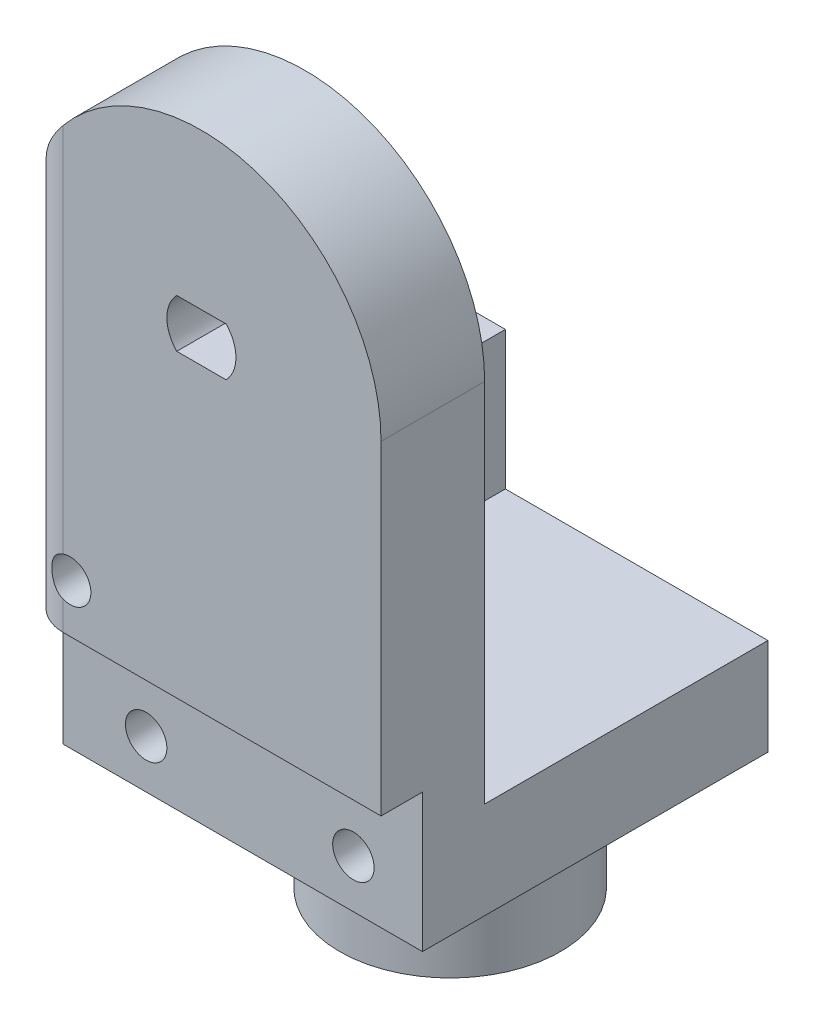
ISO-10303-21;
HEADER;
FILE_DESCRIPTION(('STEP AP214'),'2;1');
FILE_NAME('part.step','',(''),(''),'','','');
FILE_SCHEMA(('AUTOMOTIVE_DESIGN { 1 0 10303 214 1 1 1 1 }'));
ENDSEC;
DATA;
#1=APPLICATION_CONTEXT('core data for automotive mechanical design processes');
#2=APPLICATION_PROTOCOL_DEFINITION('international standard','automotive_design',2000,#1);
#3=PRODUCT_CONTEXT('',#1,'mechanical');
#4=PRODUCT('Part','Part','',(#3));
#5=PRODUCT_RELATED_PRODUCT_CATEGORY('part','',(#4));
#6=PRODUCT_DEFINITION_FORMATION('','',#4);
#7=PRODUCT_DEFINITION_CONTEXT('part definition',#1,'design');
#8=PRODUCT_DEFINITION('design','',#6,#7);
#9=PRODUCT_DEFINITION_SHAPE('','',#8);
#10=(LENGTH_UNIT() NAMED_UNIT(*) SI_UNIT(.MILLI.,.METRE.));
#11=(NAMED_UNIT(*) PLANE_ANGLE_UNIT() SI_UNIT($,.RADIAN.));
#12=(NAMED_UNIT(*) SI_UNIT($,.STERADIAN.) SOLID_ANGLE_UNIT());
#13=UNCERTAINTY_MEASURE_WITH_UNIT(LENGTH_MEASURE(1.E-05),#10,'distance_accuracy_value','');
#14=(GEOMETRIC_REPRESENTATION_CONTEXT(3) GLOBAL_UNCERTAINTY_ASSIGNED_CONTEXT((#13)) GLOBAL_UNIT_ASSIGNED_CONTEXT((#10,
#11,#12)) REPRESENTATION_CONTEXT('',''));
#15=CARTESIAN_POINT('',(0.,0.,0.));
#16=DIRECTION('',(0.,0.,1.));
#17=DIRECTION('',(1.,0.,0.));
#18=AXIS2_PLACEMENT_3D('',#15,#16,#17);
#19=CARTESIAN_POINT('',(24.2641007815364,-54.,8.));
#20=DIRECTION('',(0.,1.,0.));
#21=DIRECTION('',(0.,0.,1.));
#22=AXIS2_PLACEMENT_3D('',#19,#20,#21);
#23=PLANE('',#22);
#24=DIRECTION('',(-1.,0.,0.));
#25=VECTOR('',#24,1.);
#26=CARTESIAN_POINT('',(24.2641007815364,-54.,-20.));
#27=LINE('',#26,#25);
#28=CARTESIAN_POINT('',(50.2641007815364,-54.,-20.));
#29=VERTEX_POINT('',#28);
#30=CARTESIAN_POINT('',(37.2641007815364,-54.,-20.));
#31=VERTEX_POINT('',#30);
#32=EDGE_CURVE('E150',#29,#31,#27,.T.);
#33=ORIENTED_EDGE('',*,*,#32,.F.);
#34=DIRECTION('',(0.,0.,-1.));
#35=VECTOR('',#34,1.);
#36=CARTESIAN_POINT('',(50.2641007815364,-54.,8.));
#37=LINE('',#36,#35);
#38=CARTESIAN_POINT('',(50.2641007815364,-54.,5.));
#39=VERTEX_POINT('',#38);
#40=EDGE_CURVE('E292',#39,#29,#37,.T.);
#41=ORIENTED_EDGE('',*,*,#40,.F.);
#42=DIRECTION('',(1.,0.,0.));
#43=VECTOR('',#42,1.);
#44=CARTESIAN_POINT('',(50.2641007815364,-54.,5.));
#45=LINE('',#44,#43);
#46=CARTESIAN_POINT('',(24.2641007815364,-54.,5.));
#47=VERTEX_POINT('',#46);
#48=EDGE_CURVE('E603',#47,#39,#45,.T.);
#49=ORIENTED_EDGE('',*,*,#48,.F.);
#50=DIRECTION('',(0.,0.,-1.));
#51=VECTOR('',#50,1.);
#52=CARTESIAN_POINT('',(24.2641007815364,-54.,8.));
#53=LINE('',#52,#51);
#54=CARTESIAN_POINT('',(24.2641007815364,-54.,-20.));
#55=VERTEX_POINT('',#54);
#56=EDGE_CURVE('E167',#47,#55,#53,.T.);
#57=ORIENTED_EDGE('',*,*,#56,.T.);
#58=EDGE_CURVE('E153',#31,#55,#27,.T.);
#59=ORIENTED_EDGE('',*,*,#58,.F.);
#60=CARTESIAN_POINT('',(37.2641007815364,-54.,-10.));
#61=DIRECTION('',(0.,1.,0.));
#62=DIRECTION('',(0.,0.,1.));
#63=AXIS2_PLACEMENT_3D('',#60,#61,#62);
#64=CIRCLE('',#63,9.99999999999998);
#65=EDGE_CURVE('E164',#31,#31,#64,.T.);
#66=ORIENTED_EDGE('',*,*,#65,.T.);
#67=EDGE_LOOP('',(#33,#41,#49,#57,#59,#66));
#68=FACE_BOUND('',#67,.T.);
#69=ADVANCED_FACE('F37',(#68),#23,.F.);
#70=CARTESIAN_POINT('',(50.2641007815364,-54.,8.));
#71=DIRECTION('',(-1.,0.,0.));
#72=DIRECTION('',(0.,0.,1.));
#73=AXIS2_PLACEMENT_3D('',#70,#71,#72);
#74=PLANE('',#73);
#75=DIRECTION('',(0.,-1.,0.));
#76=VECTOR('',#75,1.);
#77=CARTESIAN_POINT('',(50.2641007815364,-54.,-20.));
#78=LINE('',#77,#76);
#79=CARTESIAN_POINT('',(50.2641007815364,-47.,-20.));
#80=VERTEX_POINT('',#79);
#81=EDGE_CURVE('E156',#80,#29,#78,.T.);
#82=ORIENTED_EDGE('',*,*,#81,.F.);
#83=DIRECTION('',(0.,0.,1.));
#84=VECTOR('',#83,1.);
#85=CARTESIAN_POINT('',(50.2641007815364,-47.,-54.9258240356725));
#86=LINE('',#85,#84);
#87=CARTESIAN_POINT('',(50.2641007815364,-47.,0.5));
#88=VERTEX_POINT('',#87);
#89=EDGE_CURVE('E267',#80,#88,#86,.T.);
#90=ORIENTED_EDGE('',*,*,#89,.T.);
#91=DIRECTION('',(0.,-1.,0.));
#92=VECTOR('',#91,1.);
#93=CARTESIAN_POINT('',(50.2641007815364,-4.,0.5));
#94=LINE('',#93,#92);
#95=CARTESIAN_POINT('',(50.2641007815364,-20.5159979477303,0.5));
#96=VERTEX_POINT('',#95);
#97=EDGE_CURVE('E238',#96,#88,#94,.T.);
#98=ORIENTED_EDGE('',*,*,#97,.F.);
#99=DIRECTION('',(0.,0.,1.));
#100=VECTOR('',#99,1.);
#101=CARTESIAN_POINT('',(50.2641007815364,-20.5159979477303,-62.5689387206191));
#102=LINE('',#101,#100);
#103=CARTESIAN_POINT('',(50.2641007815364,-20.5159979477303,8.));
#104=VERTEX_POINT('',#103);
#105=EDGE_CURVE('E599',#96,#104,#102,.T.);
#106=ORIENTED_EDGE('',*,*,#105,.T.);
#107=DIRECTION('',(0.,1.,0.));
#108=VECTOR('',#107,1.);
#109=CARTESIAN_POINT('',(50.2641007815364,-54.,8.));
#110=LINE('',#109,#108);
#111=CARTESIAN_POINT('',(50.2641007815364,-44.,8.));
#112=VERTEX_POINT('',#111);
#113=EDGE_CURVE('E290',#112,#104,#110,.T.);
#114=ORIENTED_EDGE('',*,*,#113,.F.);
#115=DIRECTION('',(0.,0.,1.));
#116=VECTOR('',#115,1.);
#117=CARTESIAN_POINT('',(50.2641007815364,-44.,5.));
#118=LINE('',#117,#116);
#119=CARTESIAN_POINT('',(50.2641007815364,-44.,5.));
#120=VERTEX_POINT('',#119);
#121=EDGE_CURVE('E605',#120,#112,#118,.T.);
#122=ORIENTED_EDGE('',*,*,#121,.F.);
#123=DIRECTION('',(0.,1.,0.));
#124=VECTOR('',#123,1.);
#125=CARTESIAN_POINT('',(50.2641007815364,-54.,5.));
#126=LINE('',#125,#124);
#127=EDGE_CURVE('E187',#39,#120,#126,.T.);
#128=ORIENTED_EDGE('',*,*,#127,.F.);
#129=ORIENTED_EDGE('',*,*,#40,.T.);
#130=EDGE_LOOP('',(#82,#90,#98,#106,#114,#122,#128,#129));
#131=FACE_BOUND('',#130,.T.);
#132=ADVANCED_FACE('F336',(#131),#74,.F.);
#133=CARTESIAN_POINT('',(24.2641007815364,-47.,-54.9258240356725));
#134=DIRECTION('',(0.,1.,0.));
#135=DIRECTION('',(0.,0.,1.));
#136=AXIS2_PLACEMENT_3D('',#133,#134,#135);
#137=PLANE('',#136);
#138=ORIENTED_EDGE('',*,*,#89,.F.);
#139=DIRECTION('',(-1.,0.,0.));
#140=VECTOR('',#139,1.);
#141=CARTESIAN_POINT('',(24.2641007815364,-47.,-20.));
#142=LINE('',#141,#140);
#143=CARTESIAN_POINT('',(31.2641007815364,-47.,-20.));
#144=VERTEX_POINT('',#143);
#145=EDGE_CURVE('E168',#80,#144,#142,.T.);
#146=ORIENTED_EDGE('',*,*,#145,.T.);
#147=DIRECTION('',(0.,0.,1.));
#148=VECTOR('',#147,1.);
#149=CARTESIAN_POINT('',(31.2641007815364,-47.,-54.9258240356725));
#150=LINE('',#149,#148);
#151=CARTESIAN_POINT('',(31.2641007815364,-47.,0.5));
#152=VERTEX_POINT('',#151);
#153=EDGE_CURVE('E256',#144,#152,#150,.T.);
#154=ORIENTED_EDGE('',*,*,#153,.T.);
#155=DIRECTION('',(-1.,0.,0.));
#156=VECTOR('',#155,1.);
#157=CARTESIAN_POINT('',(50.2641007815364,-47.,0.5));
#158=LINE('',#157,#156);
#159=EDGE_CURVE('E224',#88,#152,#158,.T.);
#160=ORIENTED_EDGE('',*,*,#159,.F.);
#161=EDGE_LOOP('',(#138,#146,#154,#160));
#162=FACE_BOUND('',#161,.T.);
#163=ADVANCED_FACE('F343',(#162),#137,.T.);
#164=CARTESIAN_POINT('',(24.2641007815364,-54.,8.));
#165=DIRECTION('',(1.,0.,0.));
#166=DIRECTION('',(0.,1.,0.));
#167=AXIS2_PLACEMENT_3D('',#164,#165,#166);
#168=PLANE('',#167);
#169=DIRECTION('',(0.,1.,0.));
#170=VECTOR('',#169,1.);
#171=CARTESIAN_POINT('',(24.2641007815364,-54.,-20.));
#172=LINE('',#171,#170);
#173=CARTESIAN_POINT('',(24.2641007815364,-37.,-20.));
#174=VERTEX_POINT('',#173);
#175=EDGE_CURVE('E568',#55,#174,#172,.T.);
#176=ORIENTED_EDGE('',*,*,#175,.F.);
#177=ORIENTED_EDGE('',*,*,#56,.F.);
#178=DIRECTION('',(0.,-1.,0.));
#179=VECTOR('',#178,1.);
#180=CARTESIAN_POINT('',(24.2641007815364,-54.,5.));
#181=LINE('',#180,#179);
#182=CARTESIAN_POINT('',(24.2641007815364,-44.,5.));
#183=VERTEX_POINT('',#182);
#184=EDGE_CURVE('E300',#47,#183,#181,.F.);
#185=ORIENTED_EDGE('',*,*,#184,.T.);
#186=CARTESIAN_POINT('',(24.2641007815364,-20.5159979477303,5.));
#187=VERTEX_POINT('',#186);
#188=EDGE_CURVE('E299',#183,#187,#181,.F.);
#189=ORIENTED_EDGE('',*,*,#188,.T.);
#190=DIRECTION('',(0.,0.,1.));
#191=VECTOR('',#190,1.);
#192=CARTESIAN_POINT('',(24.2641007815364,-20.5159979477303,-62.5689387206191));
#193=LINE('',#192,#191);
#194=CARTESIAN_POINT('',(24.2641007815364,-20.5159979477303,0.5));
#195=VERTEX_POINT('',#194);
#196=EDGE_CURVE('E615',#195,#187,#193,.T.);
#197=ORIENTED_EDGE('',*,*,#196,.F.);
#198=DIRECTION('',(0.,1.,0.));
#199=VECTOR('',#198,1.);
#200=CARTESIAN_POINT('',(24.2641007815364,-37.,0.5));
#201=LINE('',#200,#199);
#202=CARTESIAN_POINT('',(24.2641007815364,-37.,0.5));
#203=VERTEX_POINT('',#202);
#204=EDGE_CURVE('E235',#203,#195,#201,.T.);
#205=ORIENTED_EDGE('',*,*,#204,.F.);
#206=DIRECTION('',(0.,0.,-1.));
#207=VECTOR('',#206,1.);
#208=CARTESIAN_POINT('',(24.2641007815364,-37.,18.3847763108502));
#209=LINE('',#208,#207);
#210=EDGE_CURVE('E250',#203,#174,#209,.T.);
#211=ORIENTED_EDGE('',*,*,#210,.T.);
#212=EDGE_LOOP('',(#176,#177,#185,#189,#197,#205,#211));
#213=FACE_BOUND('',#212,.T.);
#214=ADVANCED_FACE('F375',(#213),#168,.F.);
#215=CARTESIAN_POINT('',(24.2641007815364,-37.,18.3847763108502));
#216=DIRECTION('',(0.,-1.,0.));
#217=DIRECTION('',(0.,0.,-1.));
#218=AXIS2_PLACEMENT_3D('',#215,#216,#217);
#219=PLANE('',#218);
#220=DIRECTION('',(1.,0.,0.));
#221=VECTOR('',#220,1.);
#222=CARTESIAN_POINT('',(24.2641007815364,-37.,-20.));
#223=LINE('',#222,#221);
#224=CARTESIAN_POINT('',(31.2641007815364,-37.,-20.));
#225=VERTEX_POINT('',#224);
#226=EDGE_CURVE('E54',#174,#225,#223,.T.);
#227=ORIENTED_EDGE('',*,*,#226,.F.);
#228=ORIENTED_EDGE('',*,*,#210,.F.);
#229=DIRECTION('',(-1.,0.,0.));
#230=VECTOR('',#229,1.);
#231=CARTESIAN_POINT('',(31.2641007815364,-37.,0.5));
#232=LINE('',#231,#230);
#233=CARTESIAN_POINT('',(31.2641007815364,-37.,0.5));
#234=VERTEX_POINT('',#233);
#235=EDGE_CURVE('E232',#234,#203,#232,.T.);
#236=ORIENTED_EDGE('',*,*,#235,.F.);
#237=DIRECTION('',(0.,0.,-1.));
#238=VECTOR('',#237,1.);
#239=CARTESIAN_POINT('',(31.2641007815364,-37.,18.3847763108502));
#240=LINE('',#239,#238);
#241=EDGE_CURVE('E253',#234,#225,#240,.T.);
#242=ORIENTED_EDGE('',*,*,#241,.T.);
#243=EDGE_LOOP('',(#227,#228,#236,#242));
#244=FACE_BOUND('',#243,.T.);
#245=ADVANCED_FACE('F480',(#244),#219,.F.);
#246=CARTESIAN_POINT('',(31.2641007815364,-37.,18.3847763108502));
#247=DIRECTION('',(-1.,0.,0.));
#248=DIRECTION('',(0.,0.,1.));
#249=AXIS2_PLACEMENT_3D('',#246,#247,#248);
#250=PLANE('',#249);
#251=DIRECTION('',(0.,-1.,0.));
#252=VECTOR('',#251,1.);
#253=CARTESIAN_POINT('',(31.2641007815364,-37.,-20.));
#254=LINE('',#253,#252);
#255=EDGE_CURVE('E572',#225,#144,#254,.T.);
#256=ORIENTED_EDGE('',*,*,#255,.F.);
#257=ORIENTED_EDGE('',*,*,#241,.F.);
#258=DIRECTION('',(0.,1.,0.));
#259=VECTOR('',#258,1.);
#260=CARTESIAN_POINT('',(31.2641007815364,-47.,0.5));
#261=LINE('',#260,#259);
#262=EDGE_CURVE('E229',#152,#234,#261,.T.);
#263=ORIENTED_EDGE('',*,*,#262,.F.);
#264=ORIENTED_EDGE('',*,*,#153,.F.);
#265=EDGE_LOOP('',(#256,#257,#263,#264));
#266=FACE_BOUND('',#265,.T.);
#267=ADVANCED_FACE('F369',(#266),#250,.F.);
#268=CARTESIAN_POINT('',(30.2641007815364,-50.5,-32.2426406871193));
#269=DIRECTION('',(0.,0.,1.));
#270=DIRECTION('',(1.,0.,0.));
#271=AXIS2_PLACEMENT_3D('',#268,#269,#270);
#272=CYLINDRICAL_SURFACE('',#271,1.5);
#273=CARTESIAN_POINT('',(30.2641007815364,-50.5,5.));
#274=DIRECTION('',(0.,0.,1.));
#275=DIRECTION('',(1.,0.,0.));
#276=AXIS2_PLACEMENT_3D('',#273,#274,#275);
#277=CIRCLE('',#276,1.5);
#278=CARTESIAN_POINT('',(31.7641007815364,-50.5,5.));
#279=VERTEX_POINT('',#278);
#280=EDGE_CURVE('E173',#279,#279,#277,.T.);
#281=ORIENTED_EDGE('',*,*,#280,.T.);
#282=EDGE_LOOP('',(#281));
#283=FACE_BOUND('',#282,.T.);
#284=CARTESIAN_POINT('',(30.2641007815364,-50.5,-20.));
#285=DIRECTION('',(0.,0.,-1.));
#286=DIRECTION('',(-1.,0.,0.));
#287=AXIS2_PLACEMENT_3D('',#284,#285,#286);
#288=CIRCLE('',#287,1.5);
#289=CARTESIAN_POINT('',(28.7641007815363,-50.5,-20.));
#290=VERTEX_POINT('',#289);
#291=EDGE_CURVE('E576',#290,#290,#288,.F.);
#292=ORIENTED_EDGE('',*,*,#291,.F.);
#293=EDGE_LOOP('',(#292));
#294=FACE_BOUND('',#293,.T.);
#295=ADVANCED_FACE('F199',(#283,#294),#272,.F.);
#296=CARTESIAN_POINT('',(45.2641007815364,-50.5,-32.2426406871193));
#297=DIRECTION('',(0.,0.,1.));
#298=DIRECTION('',(1.,0.,0.));
#299=AXIS2_PLACEMENT_3D('',#296,#297,#298);
#300=CYLINDRICAL_SURFACE('',#299,1.50000000000001);
#301=CARTESIAN_POINT('',(45.2641007815364,-50.5,5.));
#302=DIRECTION('',(0.,0.,1.));
#303=DIRECTION('',(1.,0.,0.));
#304=AXIS2_PLACEMENT_3D('',#301,#302,#303);
#305=CIRCLE('',#304,1.50000000000001);
#306=CARTESIAN_POINT('',(46.7641007815364,-50.5,5.));
#307=VERTEX_POINT('',#306);
#308=EDGE_CURVE('E176',#307,#307,#305,.T.);
#309=ORIENTED_EDGE('',*,*,#308,.T.);
#310=EDGE_LOOP('',(#309));
#311=FACE_BOUND('',#310,.T.);
#312=CARTESIAN_POINT('',(45.2641007815364,-50.5,-20.));
#313=DIRECTION('',(0.,0.,-1.));
#314=DIRECTION('',(-1.,0.,0.));
#315=AXIS2_PLACEMENT_3D('',#312,#313,#314);
#316=CIRCLE('',#315,1.50000000000001);
#317=CARTESIAN_POINT('',(43.7641007815364,-50.5,-20.));
#318=VERTEX_POINT('',#317);
#319=EDGE_CURVE('E579',#318,#318,#316,.F.);
#320=ORIENTED_EDGE('',*,*,#319,.F.);
#321=EDGE_LOOP('',(#320));
#322=FACE_BOUND('',#321,.T.);
#323=ADVANCED_FACE('F198',(#311,#322),#300,.F.);
#324=CARTESIAN_POINT('',(27.7641007815364,-40.5,-32.2426406871193));
#325=DIRECTION('',(0.,0.,1.));
#326=DIRECTION('',(1.,0.,0.));
#327=AXIS2_PLACEMENT_3D('',#324,#325,#326);
#328=CYLINDRICAL_SURFACE('',#327,1.5);
#329=CARTESIAN_POINT('',(27.2641007815364,-39.0857864376269,8.));
#330=CARTESIAN_POINT('',(27.2253764098622,-39.0994758012554,8.0000033514529));
#331=CARTESIAN_POINT('',(27.1872398223096,-39.1147511779334,7.99924969044834));
#332=CARTESIAN_POINT('',(27.1124049672147,-39.1483439544406,7.99639554637372));
#333=CARTESIAN_POINT('',(27.0757059899739,-39.1666598292808,7.99429573697298));
#334=CARTESIAN_POINT('',(26.9683945917563,-39.2258349540183,7.98624833876231));
#335=CARTESIAN_POINT('',(26.9002478821891,-39.2710354712674,7.97855004816268));
#336=CARTESIAN_POINT('',(26.7725650094892,-39.3715225141189,7.96016279064062));
#337=CARTESIAN_POINT('',(26.7130168451534,-39.4267947336636,7.94947805437924));
#338=CARTESIAN_POINT('',(26.6036411351598,-39.5461199245548,7.92692919577638));
#339=CARTESIAN_POINT('',(26.5538222201791,-39.6101806070421,7.91506404025652));
#340=CARTESIAN_POINT('',(26.4631035223383,-39.7486287000201,7.89148831564587));
#341=CARTESIAN_POINT('',(26.4227047773273,-39.823350679169,7.87980861990998));
#342=CARTESIAN_POINT('',(26.3549919419463,-39.9788500439755,7.85915755761511));
#343=CARTESIAN_POINT('',(26.3276737453529,-40.0596255201087,7.85018534145623));
#344=CARTESIAN_POINT('',(26.2873454591356,-40.2238760742147,7.83661808086728));
#345=CARTESIAN_POINT('',(26.2741460363146,-40.307299571092,7.83196522864609));
#346=CARTESIAN_POINT('',(26.2619435397858,-40.4752932979295,7.82767167034198));
#347=CARTESIAN_POINT('',(26.2629356564909,-40.5598631296837,7.82802926619111));
#348=CARTESIAN_POINT('',(26.2786509371843,-40.7232416199137,7.83353959488213));
#349=CARTESIAN_POINT('',(26.2926828527015,-40.8021264783988,7.83845090290233));
#350=CARTESIAN_POINT('',(26.332988957901,-40.9563727219857,7.85192523235886));
#351=CARTESIAN_POINT('',(26.3592653200729,-41.0317334792064,7.86048890179812));
#352=CARTESIAN_POINT('',(26.4239119241011,-41.1785740147947,7.88014611246784));
#353=CARTESIAN_POINT('',(26.4625182234548,-41.2499430838621,7.89128775412712));
#354=CARTESIAN_POINT('',(26.5506635471541,-41.3855004176895,7.91428844723964));
#355=CARTESIAN_POINT('',(26.6002093852806,-41.4496841693012,7.92614794245735));
#356=CARTESIAN_POINT('',(26.7118717122004,-41.5724006902181,7.94931449512181));
#357=CARTESIAN_POINT('',(26.7744987657441,-41.6304810197957,7.96056292194837));
#358=CARTESIAN_POINT('',(26.9089764577254,-41.7353137348819,7.97967592072812));
#359=CARTESIAN_POINT('',(26.9808099056903,-41.7820867754544,7.9875466833828));
#360=CARTESIAN_POINT('',(27.0895788653948,-41.8403221227984,7.99510792592384));
#361=CARTESIAN_POINT('',(27.1236855093381,-41.8569483752533,7.99691317637068));
#362=CARTESIAN_POINT('',(27.1930617267153,-41.8875695091476,7.99935958867335));
#363=CARTESIAN_POINT('',(27.2283301834939,-41.9015668353225,8.00000183690004));
#364=CARTESIAN_POINT('',(27.2641007815364,-41.9142135623731,8.));
#365=B_SPLINE_CURVE_WITH_KNOTS('',3,(#329,#330,#331,#332,#333,#334,#335,#336,#337,#338,#339,
#340,#341,#342,#343,#344,#345,#346,#347,#348,#349,#350,#351,#352,#353,#354,#355,#356,#357,#358,
#359,#360,#361,#362,#363,#364),.UNSPECIFIED.,.F.,.F.,(4,2,2,2,2,2,2,2,2,2,2,2,2,2,2,2,2,4),(0.,
0.123129591998816,0.246197612818093,0.491329191183859,0.736115255885062,0.981117490143601,
1.23712276472383,1.49304762179048,1.74549575480483,1.99785833385192,2.23756235213798,
2.47730891647824,2.72195234777631,2.96674858925602,3.22397514304483,3.48072820825994,
3.59457934743162,3.70832408225966),.UNSPECIFIED.);
#366=CARTESIAN_POINT('',(27.2641007815364,-39.0857864376269,8.));
#367=VERTEX_POINT('',#366);
#368=CARTESIAN_POINT('',(27.2641007815364,-41.9142135623731,8.));
#369=VERTEX_POINT('',#368);
#370=EDGE_CURVE('E179',#367,#369,#365,.T.);
#371=ORIENTED_EDGE('',*,*,#370,.T.);
#372=CARTESIAN_POINT('',(27.7641007815364,-40.5,8.));
#373=DIRECTION('',(0.,0.,1.));
#374=DIRECTION('',(1.,0.,0.));
#375=AXIS2_PLACEMENT_3D('',#372,#373,#374);
#376=CIRCLE('',#375,1.5);
#377=EDGE_CURVE('E61',#369,#367,#376,.T.);
#378=ORIENTED_EDGE('',*,*,#377,.T.);
#379=EDGE_LOOP('',(#371,#378));
#380=FACE_BOUND('',#379,.T.);
#381=CARTESIAN_POINT('',(27.7641007815364,-40.5,-20.));
#382=DIRECTION('',(0.,0.,-1.));
#383=DIRECTION('',(-1.,0.,0.));
#384=AXIS2_PLACEMENT_3D('',#381,#382,#383);
#385=CIRCLE('',#384,1.5);
#386=CARTESIAN_POINT('',(26.2641007815364,-40.5,-20.));
#387=VERTEX_POINT('',#386);
#388=EDGE_CURVE('E42',#387,#387,#385,.F.);
#389=ORIENTED_EDGE('',*,*,#388,.F.);
#390=EDGE_LOOP('',(#389));
#391=FACE_BOUND('',#390,.T.);
#392=ADVANCED_FACE('F192',(#380,#391),#328,.F.);
#393=CARTESIAN_POINT('',(0.,0.,8.));
#394=DIRECTION('',(0.,0.,-1.));
#395=DIRECTION('',(-1.,0.,0.));
#396=AXIS2_PLACEMENT_3D('',#393,#394,#395);
#397=PLANE('',#396);
#398=CARTESIAN_POINT('',(37.2641007815364,-20.5159979477303,8.));
#399=DIRECTION('',(0.,0.,1.));
#400=DIRECTION('',(1.,0.,0.));
#401=AXIS2_PLACEMENT_3D('',#398,#399,#400);
#402=CIRCLE('',#401,2.5000000003716);
#403=CARTESIAN_POINT('',(39.0494578886773,-22.2659979482559,8.));
#404=VERTEX_POINT('',#403);
#405=CARTESIAN_POINT('',(39.0494578889322,-18.7659979474649,8.));
#406=VERTEX_POINT('',#405);
#407=EDGE_CURVE('E269',#404,#406,#402,.T.);
#408=ORIENTED_EDGE('',*,*,#407,.F.);
#409=DIRECTION('',(1.,0.,0.));
#410=VECTOR('',#409,1.);
#411=CARTESIAN_POINT('',(39.0494578886773,-22.2659979482559,8.));
#412=LINE('',#411,#410);
#413=CARTESIAN_POINT('',(35.4787436749158,-22.2659979482559,8.));
#414=VERTEX_POINT('',#413);
#415=EDGE_CURVE('E276',#414,#404,#412,.T.);
#416=ORIENTED_EDGE('',*,*,#415,.F.);
#417=CARTESIAN_POINT('',(37.2641007815364,-20.5159979477303,8.));
#418=DIRECTION('',(0.,0.,1.));
#419=DIRECTION('',(1.,0.,0.));
#420=AXIS2_PLACEMENT_3D('',#417,#418,#419);
#421=CIRCLE('',#420,2.50000000000003);
#422=CARTESIAN_POINT('',(35.4787436746608,-18.7659979474649,8.));
#423=VERTEX_POINT('',#422);
#424=EDGE_CURVE('E273',#423,#414,#421,.T.);
#425=ORIENTED_EDGE('',*,*,#424,.F.);
#426=DIRECTION('',(-1.,0.,0.));
#427=VECTOR('',#426,1.);
#428=CARTESIAN_POINT('',(35.4787436746608,-18.7659979474649,8.));
#429=LINE('',#428,#427);
#430=EDGE_CURVE('E271',#406,#423,#429,.T.);
#431=ORIENTED_EDGE('',*,*,#430,.F.);
#432=EDGE_LOOP('',(#408,#416,#425,#431));
#433=FACE_BOUND('',#432,.T.);
#434=DIRECTION('',(0.,-1.,0.));
#435=VECTOR('',#434,1.);
#436=CARTESIAN_POINT('',(27.2641007815364,0.,8.));
#437=LINE('',#436,#435);
#438=CARTESIAN_POINT('',(27.2641007815364,-12.2093740848123,8.));
#439=VERTEX_POINT('',#438);
#440=EDGE_CURVE('E296',#439,#367,#437,.T.);
#441=ORIENTED_EDGE('',*,*,#440,.T.);
#442=ORIENTED_EDGE('',*,*,#377,.F.);
#443=CARTESIAN_POINT('',(27.2641007815364,-44.,8.));
#444=VERTEX_POINT('',#443);
#445=EDGE_CURVE('E295',#369,#444,#437,.T.);
#446=ORIENTED_EDGE('',*,*,#445,.T.);
#447=DIRECTION('',(-1.,0.,0.));
#448=VECTOR('',#447,1.);
#449=CARTESIAN_POINT('',(50.2641007815364,-44.,8.));
#450=LINE('',#449,#448);
#451=EDGE_CURVE('E186',#112,#444,#450,.T.);
#452=ORIENTED_EDGE('',*,*,#451,.F.);
#453=ORIENTED_EDGE('',*,*,#113,.T.);
#454=CARTESIAN_POINT('',(37.2641007815364,-20.5159979477303,8.));
#455=DIRECTION('',(0.,0.,-1.));
#456=DIRECTION('',(1.,0.,0.));
#457=AXIS2_PLACEMENT_3D('',#454,#455,#456);
#458=CIRCLE('',#457,13.);
#459=EDGE_CURVE('E608',#439,#104,#458,.T.);
#460=ORIENTED_EDGE('',*,*,#459,.F.);
#461=EDGE_LOOP('',(#441,#442,#446,#452,#453,#460));
#462=FACE_BOUND('',#461,.T.);
#463=ADVANCED_FACE('F197',(#433,#462),#397,.F.);
#464=CARTESIAN_POINT('',(0.,0.,0.5));
#465=DIRECTION('',(0.,0.,-1.));
#466=DIRECTION('',(-1.,0.,0.));
#467=AXIS2_PLACEMENT_3D('',#464,#465,#466);
#468=PLANE('',#467);
#469=DIRECTION('',(1.,0.,0.));
#470=VECTOR('',#469,1.);
#471=CARTESIAN_POINT('',(35.4787436746608,-18.7659979474649,0.5));
#472=LINE('',#471,#470);
#473=CARTESIAN_POINT('',(35.4787436746608,-18.7659979474649,0.5));
#474=VERTEX_POINT('',#473);
#475=CARTESIAN_POINT('',(39.0494578889322,-18.7659979474649,0.5));
#476=VERTEX_POINT('',#475);
#477=EDGE_CURVE('E244',#474,#476,#472,.T.);
#478=ORIENTED_EDGE('',*,*,#477,.F.);
#479=CARTESIAN_POINT('',(37.2641007815364,-20.5159979477303,0.5));
#480=DIRECTION('',(0.,0.,-1.));
#481=DIRECTION('',(-1.,0.,0.));
#482=AXIS2_PLACEMENT_3D('',#479,#480,#481);
#483=CIRCLE('',#482,2.50000000000003);
#484=CARTESIAN_POINT('',(35.4787436749158,-22.2659979482559,0.5));
#485=VERTEX_POINT('',#484);
#486=EDGE_CURVE('E241',#485,#474,#483,.T.);
#487=ORIENTED_EDGE('',*,*,#486,.F.);
#488=DIRECTION('',(-1.,0.,0.));
#489=VECTOR('',#488,1.);
#490=CARTESIAN_POINT('',(39.0494578886773,-22.2659979482559,0.5));
#491=LINE('',#490,#489);
#492=CARTESIAN_POINT('',(39.0494578886773,-22.2659979482559,0.5));
#493=VERTEX_POINT('',#492);
#494=EDGE_CURVE('E47',#493,#485,#491,.T.);
#495=ORIENTED_EDGE('',*,*,#494,.F.);
#496=CARTESIAN_POINT('',(37.2641007815364,-20.5159979477303,0.5));
#497=DIRECTION('',(0.,0.,-1.));
#498=DIRECTION('',(-1.,0.,0.));
#499=AXIS2_PLACEMENT_3D('',#496,#497,#498);
#500=CIRCLE('',#499,2.5000000003716);
#501=EDGE_CURVE('E247',#476,#493,#500,.T.);
#502=ORIENTED_EDGE('',*,*,#501,.F.);
#503=EDGE_LOOP('',(#478,#487,#495,#502));
#504=FACE_BOUND('',#503,.T.);
#505=CARTESIAN_POINT('',(37.2641007815364,-20.5159979477303,0.5));
#506=DIRECTION('',(0.,0.,-1.));
#507=DIRECTION('',(-1.,0.,0.));
#508=AXIS2_PLACEMENT_3D('',#505,#506,#507);
#509=CIRCLE('',#508,13.);
#510=EDGE_CURVE('E225',#96,#195,#509,.F.);
#511=ORIENTED_EDGE('',*,*,#510,.F.);
#512=ORIENTED_EDGE('',*,*,#97,.T.);
#513=ORIENTED_EDGE('',*,*,#159,.T.);
#514=ORIENTED_EDGE('',*,*,#262,.T.);
#515=ORIENTED_EDGE('',*,*,#235,.T.);
#516=ORIENTED_EDGE('',*,*,#204,.T.);
#517=EDGE_LOOP('',(#511,#512,#513,#514,#515,#516));
#518=FACE_BOUND('',#517,.T.);
#519=ADVANCED_FACE('F214',(#504,#518),#468,.T.);
#520=CARTESIAN_POINT('',(37.2641007815364,-20.5159979477303,8.));
#521=DIRECTION('',(0.,0.,-1.));
#522=DIRECTION('',(-1.,0.,0.));
#523=AXIS2_PLACEMENT_3D('',#520,#521,#522);
#524=CYLINDRICAL_SURFACE('',#523,2.5000000003716);
#525=DIRECTION('',(0.,0.,-1.));
#526=VECTOR('',#525,1.);
#527=CARTESIAN_POINT('',(39.0494578889322,-18.7659979474649,8.));
#528=LINE('',#527,#526);
#529=EDGE_CURVE('E287',#406,#476,#528,.T.);
#530=ORIENTED_EDGE('',*,*,#529,.T.);
#531=ORIENTED_EDGE('',*,*,#501,.T.);
#532=DIRECTION('',(0.,0.,-1.));
#533=VECTOR('',#532,1.);
#534=CARTESIAN_POINT('',(39.0494578886773,-22.2659979482559,8.));
#535=LINE('',#534,#533);
#536=EDGE_CURVE('E278',#404,#493,#535,.T.);
#537=ORIENTED_EDGE('',*,*,#536,.F.);
#538=ORIENTED_EDGE('',*,*,#407,.T.);
#539=EDGE_LOOP('',(#530,#531,#537,#538));
#540=FACE_BOUND('',#539,.T.);
#541=ADVANCED_FACE('F322',(#540),#524,.F.);
#542=CARTESIAN_POINT('',(35.4787436746608,-18.7659979474649,8.));
#543=DIRECTION('',(0.,-1.,0.));
#544=DIRECTION('',(1.,0.,0.));
#545=AXIS2_PLACEMENT_3D('',#542,#543,#544);
#546=PLANE('',#545);
#547=DIRECTION('',(0.,0.,-1.));
#548=VECTOR('',#547,1.);
#549=CARTESIAN_POINT('',(35.4787436746608,-18.7659979474649,8.));
#550=LINE('',#549,#548);
#551=EDGE_CURVE('E284',#423,#474,#550,.T.);
#552=ORIENTED_EDGE('',*,*,#551,.T.);
#553=ORIENTED_EDGE('',*,*,#477,.T.);
#554=ORIENTED_EDGE('',*,*,#529,.F.);
#555=ORIENTED_EDGE('',*,*,#430,.T.);
#556=EDGE_LOOP('',(#552,#553,#554,#555));
#557=FACE_BOUND('',#556,.T.);
#558=ADVANCED_FACE('F326',(#557),#546,.T.);
#559=CARTESIAN_POINT('',(37.2641007815364,-20.5159979477303,8.));
#560=DIRECTION('',(0.,0.,-1.));
#561=DIRECTION('',(-1.,0.,0.));
#562=AXIS2_PLACEMENT_3D('',#559,#560,#561);
#563=CYLINDRICAL_SURFACE('',#562,2.50000000000003);
#564=DIRECTION('',(0.,0.,-1.));
#565=VECTOR('',#564,1.);
#566=CARTESIAN_POINT('',(35.4787436749158,-22.2659979482559,8.));
#567=LINE('',#566,#565);
#568=EDGE_CURVE('E281',#414,#485,#567,.T.);
#569=ORIENTED_EDGE('',*,*,#568,.T.);
#570=ORIENTED_EDGE('',*,*,#486,.T.);
#571=ORIENTED_EDGE('',*,*,#551,.F.);
#572=ORIENTED_EDGE('',*,*,#424,.T.);
#573=EDGE_LOOP('',(#569,#570,#571,#572));
#574=FACE_BOUND('',#573,.T.);
#575=ADVANCED_FACE('F313',(#574),#563,.F.);
#576=CARTESIAN_POINT('',(39.0494578886773,-22.2659979482559,8.));
#577=DIRECTION('',(0.,1.,0.));
#578=DIRECTION('',(-1.,0.,0.));
#579=AXIS2_PLACEMENT_3D('',#576,#577,#578);
#580=PLANE('',#579);
#581=ORIENTED_EDGE('',*,*,#536,.T.);
#582=ORIENTED_EDGE('',*,*,#494,.T.);
#583=ORIENTED_EDGE('',*,*,#568,.F.);
#584=ORIENTED_EDGE('',*,*,#415,.T.);
#585=EDGE_LOOP('',(#581,#582,#583,#584));
#586=FACE_BOUND('',#585,.T.);
#587=ADVANCED_FACE('F309',(#586),#580,.T.);
#588=CARTESIAN_POINT('',(37.2641007815364,-64.,-10.));
#589=DIRECTION('',(0.,-1.,0.));
#590=DIRECTION('',(0.,0.,-1.));
#591=AXIS2_PLACEMENT_3D('',#588,#589,#590);
#592=PLANE('',#591);
#593=CARTESIAN_POINT('',(37.2641007815364,-64.,-10.));
#594=DIRECTION('',(0.,-1.,0.));
#595=DIRECTION('',(0.,0.,-1.));
#596=AXIS2_PLACEMENT_3D('',#593,#594,#595);
#597=CIRCLE('',#596,8.);
#598=CARTESIAN_POINT('',(37.2641007815364,-64.,-18.));
#599=VERTEX_POINT('',#598);
#600=EDGE_CURVE('E262',#599,#599,#597,.T.);
#601=ORIENTED_EDGE('',*,*,#600,.T.);
#602=EDGE_LOOP('',(#601));
#603=FACE_BOUND('',#602,.T.);
#604=CARTESIAN_POINT('',(37.2641007815364,-64.,-10.));
#605=DIRECTION('',(0.,-1.,0.));
#606=DIRECTION('',(0.,0.,-1.));
#607=AXIS2_PLACEMENT_3D('',#604,#605,#606);
#608=CIRCLE('',#607,5.);
#609=CARTESIAN_POINT('',(37.2641007815364,-64.,-15.));
#610=VERTEX_POINT('',#609);
#611=EDGE_CURVE('E259',#610,#610,#608,.T.);
#612=ORIENTED_EDGE('',*,*,#611,.F.);
#613=EDGE_LOOP('',(#612));
#614=FACE_BOUND('',#613,.T.);
#615=ADVANCED_FACE('F364',(#603,#614),#592,.T.);
#616=CARTESIAN_POINT('',(37.2641007815364,-64.,-10.));
#617=DIRECTION('',(0.,1.,0.));
#618=DIRECTION('',(0.,0.,1.));
#619=AXIS2_PLACEMENT_3D('',#616,#617,#618);
#620=CYLINDRICAL_SURFACE('',#619,8.);
#621=CARTESIAN_POINT('',(37.2641007815364,-56.,-10.));
#622=DIRECTION('',(0.,1.,0.));
#623=DIRECTION('',(0.,0.,1.));
#624=AXIS2_PLACEMENT_3D('',#621,#622,#623);
#625=CIRCLE('',#624,8.);
#626=CARTESIAN_POINT('',(37.2641007815364,-56.,-2.));
#627=VERTEX_POINT('',#626);
#628=EDGE_CURVE('E303',#627,#627,#625,.F.);
#629=ORIENTED_EDGE('',*,*,#628,.T.);
#630=EDGE_LOOP('',(#629));
#631=FACE_BOUND('',#630,.T.);
#632=ORIENTED_EDGE('',*,*,#600,.F.);
#633=EDGE_LOOP('',(#632));
#634=FACE_BOUND('',#633,.T.);
#635=ADVANCED_FACE('F356',(#631,#634),#620,.T.);
#636=CARTESIAN_POINT('',(37.2641007815364,-64.,-10.));
#637=DIRECTION('',(0.,1.,0.));
#638=DIRECTION('',(0.,0.,1.));
#639=AXIS2_PLACEMENT_3D('',#636,#637,#638);
#640=CYLINDRICAL_SURFACE('',#639,5.);
#641=ORIENTED_EDGE('',*,*,#611,.T.);
#642=EDGE_LOOP('',(#641));
#643=FACE_BOUND('',#642,.T.);
#644=CARTESIAN_POINT('',(37.2641007815364,-54.,-10.));
#645=DIRECTION('',(0.,-1.,0.));
#646=DIRECTION('',(0.,0.,-1.));
#647=AXIS2_PLACEMENT_3D('',#644,#645,#646);
#648=CIRCLE('',#647,5.);
#649=CARTESIAN_POINT('',(37.2641007815364,-54.,-15.));
#650=VERTEX_POINT('',#649);
#651=EDGE_CURVE('E258',#650,#650,#648,.T.);
#652=ORIENTED_EDGE('',*,*,#651,.F.);
#653=EDGE_LOOP('',(#652));
#654=FACE_BOUND('',#653,.T.);
#655=ADVANCED_FACE('F348',(#643,#654),#640,.F.);
#656=ORIENTED_EDGE('',*,*,#651,.T.);
#657=EDGE_LOOP('',(#656));
#658=FACE_BOUND('',#657,.T.);
#659=ADVANCED_FACE('F338',(#658),#23,.F.);
#660=CARTESIAN_POINT('',(27.2641007815364,0.,5.));
#661=DIRECTION('',(0.,-1.,0.));
#662=DIRECTION('',(1.,0.,0.));
#663=AXIS2_PLACEMENT_3D('',#660,#661,#662);
#664=CYLINDRICAL_SURFACE('',#663,3.);
#665=ORIENTED_EDGE('',*,*,#370,.F.);
#666=ORIENTED_EDGE('',*,*,#440,.F.);
#667=CARTESIAN_POINT('',(27.2641007815364,-12.2093740848123,8.));
#668=CARTESIAN_POINT('',(27.1973049051906,-12.2897842724645,7.99999514862239));
#669=CARTESIAN_POINT('',(27.1314980357586,-12.3709826228228,7.99776980815036));
#670=CARTESIAN_POINT('',(27.0019796539588,-12.5347850051342,7.98923220129225));
#671=CARTESIAN_POINT('',(26.9382675029312,-12.6173885967658,7.98292119296041));
#672=CARTESIAN_POINT('',(26.750641733987,-12.8667894944125,7.9584213011743));
#673=CARTESIAN_POINT('',(26.6299677524984,-13.035503480434,7.93466264233202));
#674=CARTESIAN_POINT('',(26.3987048470992,-13.3756081610308,7.8749340465294));
#675=CARTESIAN_POINT('',(26.2880460003661,-13.5469686108888,7.8390586634014));
#676=CARTESIAN_POINT('',(26.0758630713359,-13.8929656900783,7.75699691414019));
#677=CARTESIAN_POINT('',(25.9743450631766,-14.0676044060544,7.71080376171419));
#678=CARTESIAN_POINT('',(25.7238018290738,-14.5224302617938,7.58021702378969));
#679=CARTESIAN_POINT('',(25.5817311771909,-14.8045915403346,7.4892855917966));
#680=CARTESIAN_POINT('',(25.3203221642993,-15.3735976367171,7.29099150080066));
#681=CARTESIAN_POINT('',(25.2009924117963,-15.6604441837202,7.18362264708196));
#682=CARTESIAN_POINT('',(24.9839591068798,-16.238853358565,6.95596423225799));
#683=CARTESIAN_POINT('',(24.8863584196065,-16.5304316888519,6.83561705667003));
#684=CARTESIAN_POINT('',(24.7128945653175,-17.1159347281132,6.58570811366048));
#685=CARTESIAN_POINT('',(24.6370265184561,-17.4098588950943,6.45614842298477));
#686=CARTESIAN_POINT('',(24.4691752728013,-18.167627648702,6.11466443904743));
#687=CARTESIAN_POINT('',(24.3926817062925,-18.6327704900423,5.89791017036676));
#688=CARTESIAN_POINT('',(24.2905849825227,-19.5638518527441,5.45735246315833));
#689=CARTESIAN_POINT('',(24.2648529368461,-20.0297853446372,5.23356834734692));
#690=CARTESIAN_POINT('',(24.2641062034816,-20.5022948028889,5.00658277672409));
#691=CARTESIAN_POINT('',(24.2641007870804,-20.5091464071625,5.00329137244989));
#692=CARTESIAN_POINT('',(24.2641007815364,-20.5159979477303,5.));
#693=B_SPLINE_CURVE_WITH_KNOTS('',3,(#667,#668,#669,#670,#671,#672,#673,#674,#675,#676,#677,
#678,#679,#680,#681,#682,#683,#684,#685,#686,#687,#688,#689,#690,#691,#692),.UNSPECIFIED.,.F.,
.F.,(4,2,2,2,2,2,2,2,2,2,2,2,4),(0.,0.313529968759423,0.626963441613278,1.25256173228844,
1.87338677642541,2.4946213637476,3.47931562976942,4.46438191191313,5.4540167545284,
6.44342921009862,7.99716851464404,9.54695762074902,9.56976113504105),.UNSPECIFIED.);
#694=EDGE_CURVE('E217',#187,#439,#693,.F.);
#695=ORIENTED_EDGE('',*,*,#694,.F.);
#696=ORIENTED_EDGE('',*,*,#188,.F.);
#697=CARTESIAN_POINT('',(27.2641007815364,-44.,5.));
#698=DIRECTION('',(0.,1.,0.));
#699=DIRECTION('',(-1.,0.,0.));
#700=AXIS2_PLACEMENT_3D('',#697,#698,#699);
#701=CIRCLE('',#700,3.);
#702=EDGE_CURVE('E11',#444,#183,#701,.F.);
#703=ORIENTED_EDGE('',*,*,#702,.F.);
#704=ORIENTED_EDGE('',*,*,#445,.F.);
#705=EDGE_LOOP('',(#665,#666,#695,#696,#703,#704));
#706=FACE_BOUND('',#705,.T.);
#707=ADVANCED_FACE('F189',(#706),#664,.T.);
#708=CARTESIAN_POINT('',(37.2641007815364,-56.,-10.));
#709=DIRECTION('',(0.,1.,0.));
#710=DIRECTION('',(0.,0.,1.));
#711=AXIS2_PLACEMENT_3D('',#708,#709,#710);
#712=CONICAL_SURFACE('',#711,8.,0.785398163397444);
#713=ORIENTED_EDGE('',*,*,#65,.F.);
#714=EDGE_LOOP('',(#713));
#715=FACE_BOUND('',#714,.T.);
#716=ORIENTED_EDGE('',*,*,#628,.F.);
#717=EDGE_LOOP('',(#716));
#718=FACE_BOUND('',#717,.T.);
#719=ADVANCED_FACE('F40',(#715,#718),#712,.T.);
#720=CARTESIAN_POINT('',(37.2641007815364,-20.5159979477303,-62.5689387206191));
#721=DIRECTION('',(0.,0.,1.));
#722=DIRECTION('',(1.,0.,0.));
#723=AXIS2_PLACEMENT_3D('',#720,#721,#722);
#724=CYLINDRICAL_SURFACE('',#723,13.);
#725=ORIENTED_EDGE('',*,*,#694,.T.);
#726=ORIENTED_EDGE('',*,*,#459,.T.);
#727=ORIENTED_EDGE('',*,*,#105,.F.);
#728=ORIENTED_EDGE('',*,*,#510,.T.);
#729=ORIENTED_EDGE('',*,*,#196,.T.);
#730=EDGE_LOOP('',(#725,#726,#727,#728,#729));
#731=FACE_BOUND('',#730,.T.);
#732=ADVANCED_FACE('F208',(#731),#724,.T.);
#733=CARTESIAN_POINT('',(50.2641007815364,-44.,5.));
#734=DIRECTION('',(0.,1.,0.));
#735=DIRECTION('',(-1.,0.,0.));
#736=AXIS2_PLACEMENT_3D('',#733,#734,#735);
#737=PLANE('',#736);
#738=ORIENTED_EDGE('',*,*,#702,.T.);
#739=DIRECTION('',(-1.,0.,0.));
#740=VECTOR('',#739,1.);
#741=CARTESIAN_POINT('',(50.2641007815364,-44.,5.));
#742=LINE('',#741,#740);
#743=EDGE_CURVE('E606',#120,#183,#742,.T.);
#744=ORIENTED_EDGE('',*,*,#743,.F.);
#745=ORIENTED_EDGE('',*,*,#121,.T.);
#746=ORIENTED_EDGE('',*,*,#451,.T.);
#747=EDGE_LOOP('',(#738,#744,#745,#746));
#748=FACE_BOUND('',#747,.T.);
#749=ADVANCED_FACE('F204',(#748),#737,.F.);
#750=CARTESIAN_POINT('',(0.,0.,5.));
#751=DIRECTION('',(0.,0.,1.));
#752=DIRECTION('',(1.,0.,0.));
#753=AXIS2_PLACEMENT_3D('',#750,#751,#752);
#754=PLANE('',#753);
#755=ORIENTED_EDGE('',*,*,#308,.F.);
#756=EDGE_LOOP('',(#755));
#757=FACE_BOUND('',#756,.T.);
#758=ORIENTED_EDGE('',*,*,#280,.F.);
#759=EDGE_LOOP('',(#758));
#760=FACE_BOUND('',#759,.T.);
#761=ORIENTED_EDGE('',*,*,#127,.T.);
#762=ORIENTED_EDGE('',*,*,#743,.T.);
#763=ORIENTED_EDGE('',*,*,#184,.F.);
#764=ORIENTED_EDGE('',*,*,#48,.T.);
#765=EDGE_LOOP('',(#761,#762,#763,#764));
#766=FACE_BOUND('',#765,.T.);
#767=ADVANCED_FACE('F201',(#757,#760,#766),#754,.T.);
#768=CARTESIAN_POINT('',(0.,0.,-20.));
#769=DIRECTION('',(0.,0.,-1.));
#770=DIRECTION('',(-1.,0.,0.));
#771=AXIS2_PLACEMENT_3D('',#768,#769,#770);
#772=PLANE('',#771);
#773=ORIENTED_EDGE('',*,*,#291,.T.);
#774=EDGE_LOOP('',(#773));
#775=FACE_BOUND('',#774,.T.);
#776=ORIENTED_EDGE('',*,*,#319,.T.);
#777=EDGE_LOOP('',(#776));
#778=FACE_BOUND('',#777,.T.);
#779=ORIENTED_EDGE('',*,*,#388,.T.);
#780=EDGE_LOOP('',(#779));
#781=FACE_BOUND('',#780,.T.);
#782=ORIENTED_EDGE('',*,*,#32,.T.);
#783=ORIENTED_EDGE('',*,*,#58,.T.);
#784=ORIENTED_EDGE('',*,*,#175,.T.);
#785=ORIENTED_EDGE('',*,*,#226,.T.);
#786=ORIENTED_EDGE('',*,*,#255,.T.);
#787=ORIENTED_EDGE('',*,*,#145,.F.);
#788=ORIENTED_EDGE('',*,*,#81,.T.);
#789=EDGE_LOOP('',(#782,#783,#784,#785,#786,#787,#788));
#790=FACE_BOUND('',#789,.T.);
#791=ADVANCED_FACE('F152',(#775,#778,#781,#790),#772,.T.);
#792=CLOSED_SHELL('',(#69,#132,#163,#214,#245,#267,#295,#323,#392,#463,#519,#541,#558,#575,#587,
#615,#635,#655,#659,#707,#719,#732,#749,#767,#791));
#793=MANIFOLD_SOLID_BREP('B2',#792);
#794=ADVANCED_BREP_SHAPE_REPRESENTATION('',(#18,#793),#14);
#795=SHAPE_DEFINITION_REPRESENTATION(#9,#794);
ENDSEC;
END-ISO-10303-21;
